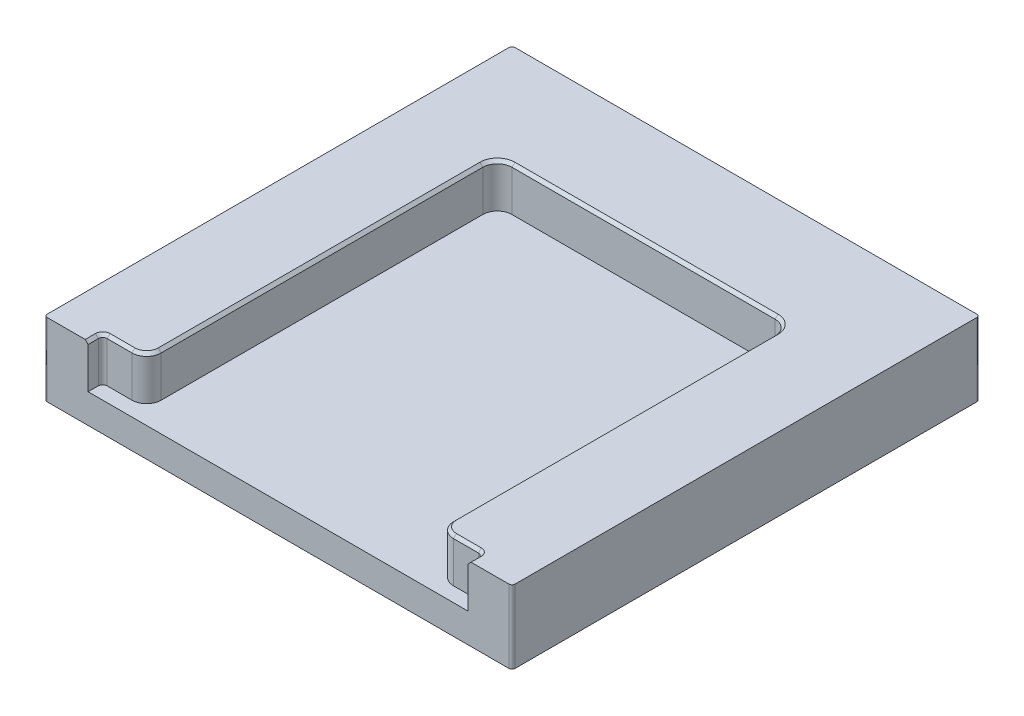
ISO-10303-21;
HEADER;
FILE_DESCRIPTION(('STEP AP214'),'2;1');
FILE_NAME('part.step','',(''),(''),'','','');
FILE_SCHEMA(('AUTOMOTIVE_DESIGN { 1 0 10303 214 1 1 1 1 }'));
ENDSEC;
DATA;
#1=APPLICATION_CONTEXT('core data for automotive mechanical design processes');
#2=APPLICATION_PROTOCOL_DEFINITION('international standard','automotive_design',2000,#1);
#3=PRODUCT_CONTEXT('',#1,'mechanical');
#4=PRODUCT('Part','Part','',(#3));
#5=PRODUCT_RELATED_PRODUCT_CATEGORY('part','',(#4));
#6=PRODUCT_DEFINITION_FORMATION('','',#4);
#7=PRODUCT_DEFINITION_CONTEXT('part definition',#1,'design');
#8=PRODUCT_DEFINITION('design','',#6,#7);
#9=PRODUCT_DEFINITION_SHAPE('','',#8);
#10=(LENGTH_UNIT() NAMED_UNIT(*) SI_UNIT(.MILLI.,.METRE.));
#11=(NAMED_UNIT(*) PLANE_ANGLE_UNIT() SI_UNIT($,.RADIAN.));
#12=(NAMED_UNIT(*) SI_UNIT($,.STERADIAN.) SOLID_ANGLE_UNIT());
#13=UNCERTAINTY_MEASURE_WITH_UNIT(LENGTH_MEASURE(1.E-05),#10,'distance_accuracy_value','');
#14=(GEOMETRIC_REPRESENTATION_CONTEXT(3) GLOBAL_UNCERTAINTY_ASSIGNED_CONTEXT((#13)) GLOBAL_UNIT_ASSIGNED_CONTEXT((#10,
#11,#12)) REPRESENTATION_CONTEXT('',''));
#15=CARTESIAN_POINT('',(0.,0.,0.));
#16=DIRECTION('',(0.,0.,1.));
#17=DIRECTION('',(1.,0.,0.));
#18=AXIS2_PLACEMENT_3D('',#15,#16,#17);
#19=CARTESIAN_POINT('',(158.,-50.,158.));
#20=DIRECTION('',(0.,1.,0.));
#21=DIRECTION('',(0.,0.,1.));
#22=AXIS2_PLACEMENT_3D('',#19,#20,#21);
#23=CYLINDRICAL_SURFACE('',#22,2.);
#24=CARTESIAN_POINT('',(158.,0.,158.));
#25=DIRECTION('',(0.,1.,0.));
#26=DIRECTION('',(0.,0.,-1.));
#27=AXIS2_PLACEMENT_3D('',#24,#25,#26);
#28=CIRCLE('',#27,2.);
#29=CARTESIAN_POINT('',(158.,0.,160.));
#30=VERTEX_POINT('',#29);
#31=CARTESIAN_POINT('',(160.,0.,158.));
#32=VERTEX_POINT('',#31);
#33=EDGE_CURVE('E293',#30,#32,#28,.T.);
#34=ORIENTED_EDGE('',*,*,#33,.F.);
#35=DIRECTION('',(0.,1.,0.));
#36=VECTOR('',#35,1.);
#37=CARTESIAN_POINT('',(158.,-50.,160.));
#38=LINE('',#37,#36);
#39=CARTESIAN_POINT('',(158.,-50.,160.));
#40=VERTEX_POINT('',#39);
#41=EDGE_CURVE('E318',#40,#30,#38,.T.);
#42=ORIENTED_EDGE('',*,*,#41,.F.);
#43=CARTESIAN_POINT('',(158.,-50.,158.));
#44=DIRECTION('',(0.,1.,0.));
#45=DIRECTION('',(0.,0.,-1.));
#46=AXIS2_PLACEMENT_3D('',#43,#44,#45);
#47=CIRCLE('',#46,2.);
#48=CARTESIAN_POINT('',(160.,-50.,158.));
#49=VERTEX_POINT('',#48);
#50=EDGE_CURVE('E267',#40,#49,#47,.T.);
#51=ORIENTED_EDGE('',*,*,#50,.T.);
#52=DIRECTION('',(0.,1.,0.));
#53=VECTOR('',#52,1.);
#54=CARTESIAN_POINT('',(160.,-50.,158.));
#55=LINE('',#54,#53);
#56=EDGE_CURVE('E292',#49,#32,#55,.T.);
#57=ORIENTED_EDGE('',*,*,#56,.T.);
#58=EDGE_LOOP('',(#34,#42,#51,#57));
#59=FACE_BOUND('',#58,.T.);
#60=ADVANCED_FACE('F39',(#59),#23,.T.);
#61=CARTESIAN_POINT('',(-158.,-50.,160.));
#62=DIRECTION('',(0.,0.,1.));
#63=DIRECTION('',(1.,0.,0.));
#64=AXIS2_PLACEMENT_3D('',#61,#62,#63);
#65=PLANE('',#64);
#66=DIRECTION('',(1.,0.,0.));
#67=VECTOR('',#66,1.);
#68=CARTESIAN_POINT('',(-158.,0.,160.));
#69=LINE('',#68,#67);
#70=CARTESIAN_POINT('',(132.,0.,160.));
#71=VERTEX_POINT('',#70);
#72=EDGE_CURVE('E315',#71,#30,#69,.T.);
#73=ORIENTED_EDGE('',*,*,#72,.F.);
#74=DIRECTION('',(0.707106781186548,0.707106781186548,0.));
#75=VECTOR('',#74,1.);
#76=CARTESIAN_POINT('',(-38.,-170.,160.));
#77=LINE('',#76,#75);
#78=CARTESIAN_POINT('',(130.,-1.99999999999995,160.));
#79=VERTEX_POINT('',#78);
#80=EDGE_CURVE('E259',#71,#79,#77,.F.);
#81=ORIENTED_EDGE('',*,*,#80,.T.);
#82=DIRECTION('',(0.,1.,0.));
#83=VECTOR('',#82,1.);
#84=CARTESIAN_POINT('',(130.,-30.,160.));
#85=LINE('',#84,#83);
#86=CARTESIAN_POINT('',(130.,-30.,160.));
#87=VERTEX_POINT('',#86);
#88=EDGE_CURVE('E237',#87,#79,#85,.T.);
#89=ORIENTED_EDGE('',*,*,#88,.F.);
#90=DIRECTION('',(1.,0.,0.));
#91=VECTOR('',#90,1.);
#92=CARTESIAN_POINT('',(-130.,-30.,160.));
#93=LINE('',#92,#91);
#94=CARTESIAN_POINT('',(-130.,-30.,160.));
#95=VERTEX_POINT('',#94);
#96=EDGE_CURVE('E245',#95,#87,#93,.T.);
#97=ORIENTED_EDGE('',*,*,#96,.F.);
#98=DIRECTION('',(0.,1.,0.));
#99=VECTOR('',#98,1.);
#100=CARTESIAN_POINT('',(-130.,-30.,160.));
#101=LINE('',#100,#99);
#102=CARTESIAN_POINT('',(-130.,-1.99999999999995,160.));
#103=VERTEX_POINT('',#102);
#104=EDGE_CURVE('E297',#95,#103,#101,.T.);
#105=ORIENTED_EDGE('',*,*,#104,.T.);
#106=DIRECTION('',(0.707106781186548,-0.707106781186548,0.));
#107=VECTOR('',#106,1.);
#108=CARTESIAN_POINT('',(-120.,-12.,160.));
#109=LINE('',#108,#107);
#110=CARTESIAN_POINT('',(-132.,0.,160.));
#111=VERTEX_POINT('',#110);
#112=EDGE_CURVE('E362',#103,#111,#109,.F.);
#113=ORIENTED_EDGE('',*,*,#112,.T.);
#114=CARTESIAN_POINT('',(-158.,0.,160.));
#115=VERTEX_POINT('',#114);
#116=EDGE_CURVE('E271',#115,#111,#69,.T.);
#117=ORIENTED_EDGE('',*,*,#116,.F.);
#118=DIRECTION('',(0.,1.,0.));
#119=VECTOR('',#118,1.);
#120=CARTESIAN_POINT('',(-158.,-50.,160.));
#121=LINE('',#120,#119);
#122=CARTESIAN_POINT('',(-158.,-50.,160.));
#123=VERTEX_POINT('',#122);
#124=EDGE_CURVE('E322',#123,#115,#121,.T.);
#125=ORIENTED_EDGE('',*,*,#124,.F.);
#126=DIRECTION('',(1.,0.,0.));
#127=VECTOR('',#126,1.);
#128=CARTESIAN_POINT('',(-158.,-50.,160.));
#129=LINE('',#128,#127);
#130=EDGE_CURVE('E289',#123,#40,#129,.T.);
#131=ORIENTED_EDGE('',*,*,#130,.T.);
#132=ORIENTED_EDGE('',*,*,#41,.T.);
#133=EDGE_LOOP('',(#73,#81,#89,#97,#105,#113,#117,#125,#131,#132));
#134=FACE_BOUND('',#133,.T.);
#135=ADVANCED_FACE('F257',(#134),#65,.T.);
#136=CARTESIAN_POINT('',(-158.,-50.,158.));
#137=DIRECTION('',(0.,1.,0.));
#138=DIRECTION('',(0.,0.,1.));
#139=AXIS2_PLACEMENT_3D('',#136,#137,#138);
#140=CYLINDRICAL_SURFACE('',#139,2.);
#141=CARTESIAN_POINT('',(-158.,0.,158.));
#142=DIRECTION('',(0.,1.,0.));
#143=DIRECTION('',(0.,0.,-1.));
#144=AXIS2_PLACEMENT_3D('',#141,#142,#143);
#145=CIRCLE('',#144,2.);
#146=CARTESIAN_POINT('',(-160.,0.,158.));
#147=VERTEX_POINT('',#146);
#148=EDGE_CURVE('E312',#147,#115,#145,.T.);
#149=ORIENTED_EDGE('',*,*,#148,.F.);
#150=DIRECTION('',(0.,1.,0.));
#151=VECTOR('',#150,1.);
#152=CARTESIAN_POINT('',(-160.,-50.,158.));
#153=LINE('',#152,#151);
#154=CARTESIAN_POINT('',(-160.,-50.,158.));
#155=VERTEX_POINT('',#154);
#156=EDGE_CURVE('E324',#155,#147,#153,.T.);
#157=ORIENTED_EDGE('',*,*,#156,.F.);
#158=CARTESIAN_POINT('',(-158.,-50.,158.));
#159=DIRECTION('',(0.,1.,0.));
#160=DIRECTION('',(0.,0.,-1.));
#161=AXIS2_PLACEMENT_3D('',#158,#159,#160);
#162=CIRCLE('',#161,2.);
#163=EDGE_CURVE('E286',#155,#123,#162,.T.);
#164=ORIENTED_EDGE('',*,*,#163,.T.);
#165=ORIENTED_EDGE('',*,*,#124,.T.);
#166=EDGE_LOOP('',(#149,#157,#164,#165));
#167=FACE_BOUND('',#166,.T.);
#168=ADVANCED_FACE('F545',(#167),#140,.T.);
#169=CARTESIAN_POINT('',(-160.,-50.,158.));
#170=DIRECTION('',(-1.,0.,0.));
#171=DIRECTION('',(0.,0.,1.));
#172=AXIS2_PLACEMENT_3D('',#169,#170,#171);
#173=PLANE('',#172);
#174=DIRECTION('',(0.,0.,1.));
#175=VECTOR('',#174,1.);
#176=CARTESIAN_POINT('',(-160.,0.,158.));
#177=LINE('',#176,#175);
#178=CARTESIAN_POINT('',(-160.,0.,-158.));
#179=VERTEX_POINT('',#178);
#180=EDGE_CURVE('E309',#179,#147,#177,.T.);
#181=ORIENTED_EDGE('',*,*,#180,.F.);
#182=DIRECTION('',(0.,1.,0.));
#183=VECTOR('',#182,1.);
#184=CARTESIAN_POINT('',(-160.,-50.,-158.));
#185=LINE('',#184,#183);
#186=CARTESIAN_POINT('',(-160.,-50.,-158.));
#187=VERTEX_POINT('',#186);
#188=EDGE_CURVE('E326',#187,#179,#185,.T.);
#189=ORIENTED_EDGE('',*,*,#188,.F.);
#190=DIRECTION('',(0.,0.,1.));
#191=VECTOR('',#190,1.);
#192=CARTESIAN_POINT('',(-160.,-50.,158.));
#193=LINE('',#192,#191);
#194=EDGE_CURVE('E283',#187,#155,#193,.T.);
#195=ORIENTED_EDGE('',*,*,#194,.T.);
#196=ORIENTED_EDGE('',*,*,#156,.T.);
#197=EDGE_LOOP('',(#181,#189,#195,#196));
#198=FACE_BOUND('',#197,.T.);
#199=ADVANCED_FACE('F849',(#198),#173,.T.);
#200=CARTESIAN_POINT('',(-158.,-50.,-158.));
#201=DIRECTION('',(0.,1.,0.));
#202=DIRECTION('',(0.,0.,1.));
#203=AXIS2_PLACEMENT_3D('',#200,#201,#202);
#204=CYLINDRICAL_SURFACE('',#203,2.);
#205=CARTESIAN_POINT('',(-158.,0.,-158.));
#206=DIRECTION('',(0.,1.,0.));
#207=DIRECTION('',(0.,0.,1.));
#208=AXIS2_PLACEMENT_3D('',#205,#206,#207);
#209=CIRCLE('',#208,2.);
#210=CARTESIAN_POINT('',(-158.,0.,-160.));
#211=VERTEX_POINT('',#210);
#212=EDGE_CURVE('E306',#211,#179,#209,.T.);
#213=ORIENTED_EDGE('',*,*,#212,.F.);
#214=DIRECTION('',(0.,1.,0.));
#215=VECTOR('',#214,1.);
#216=CARTESIAN_POINT('',(-158.,-50.,-160.));
#217=LINE('',#216,#215);
#218=CARTESIAN_POINT('',(-158.,-50.,-160.));
#219=VERTEX_POINT('',#218);
#220=EDGE_CURVE('E328',#219,#211,#217,.T.);
#221=ORIENTED_EDGE('',*,*,#220,.F.);
#222=CARTESIAN_POINT('',(-158.,-50.,-158.));
#223=DIRECTION('',(0.,1.,0.));
#224=DIRECTION('',(0.,0.,1.));
#225=AXIS2_PLACEMENT_3D('',#222,#223,#224);
#226=CIRCLE('',#225,2.);
#227=EDGE_CURVE('E280',#219,#187,#226,.T.);
#228=ORIENTED_EDGE('',*,*,#227,.T.);
#229=ORIENTED_EDGE('',*,*,#188,.T.);
#230=EDGE_LOOP('',(#213,#221,#228,#229));
#231=FACE_BOUND('',#230,.T.);
#232=ADVANCED_FACE('F840',(#231),#204,.T.);
#233=CARTESIAN_POINT('',(-158.,-50.,-160.));
#234=DIRECTION('',(0.,0.,-1.));
#235=DIRECTION('',(-1.,0.,0.));
#236=AXIS2_PLACEMENT_3D('',#233,#234,#235);
#237=PLANE('',#236);
#238=DIRECTION('',(-1.,0.,0.));
#239=VECTOR('',#238,1.);
#240=CARTESIAN_POINT('',(-158.,0.,-160.));
#241=LINE('',#240,#239);
#242=CARTESIAN_POINT('',(158.,0.,-160.));
#243=VERTEX_POINT('',#242);
#244=EDGE_CURVE('E303',#243,#211,#241,.T.);
#245=ORIENTED_EDGE('',*,*,#244,.F.);
#246=DIRECTION('',(0.,1.,0.));
#247=VECTOR('',#246,1.);
#248=CARTESIAN_POINT('',(158.,-50.,-160.));
#249=LINE('',#248,#247);
#250=CARTESIAN_POINT('',(158.,-50.,-160.));
#251=VERTEX_POINT('',#250);
#252=EDGE_CURVE('E330',#251,#243,#249,.T.);
#253=ORIENTED_EDGE('',*,*,#252,.F.);
#254=DIRECTION('',(-1.,0.,0.));
#255=VECTOR('',#254,1.);
#256=CARTESIAN_POINT('',(-158.,-50.,-160.));
#257=LINE('',#256,#255);
#258=EDGE_CURVE('E277',#251,#219,#257,.T.);
#259=ORIENTED_EDGE('',*,*,#258,.T.);
#260=ORIENTED_EDGE('',*,*,#220,.T.);
#261=EDGE_LOOP('',(#245,#253,#259,#260));
#262=FACE_BOUND('',#261,.T.);
#263=ADVANCED_FACE('F832',(#262),#237,.T.);
#264=CARTESIAN_POINT('',(158.,-50.,-158.));
#265=DIRECTION('',(0.,1.,0.));
#266=DIRECTION('',(0.,0.,1.));
#267=AXIS2_PLACEMENT_3D('',#264,#265,#266);
#268=CYLINDRICAL_SURFACE('',#267,2.);
#269=CARTESIAN_POINT('',(158.,0.,-158.));
#270=DIRECTION('',(0.,1.,0.));
#271=DIRECTION('',(0.,0.,1.));
#272=AXIS2_PLACEMENT_3D('',#269,#270,#271);
#273=CIRCLE('',#272,2.);
#274=CARTESIAN_POINT('',(160.,0.,-158.));
#275=VERTEX_POINT('',#274);
#276=EDGE_CURVE('E300',#275,#243,#273,.T.);
#277=ORIENTED_EDGE('',*,*,#276,.F.);
#278=DIRECTION('',(0.,1.,0.));
#279=VECTOR('',#278,1.);
#280=CARTESIAN_POINT('',(160.,-50.,-158.));
#281=LINE('',#280,#279);
#282=CARTESIAN_POINT('',(160.,-50.,-158.));
#283=VERTEX_POINT('',#282);
#284=EDGE_CURVE('E332',#283,#275,#281,.T.);
#285=ORIENTED_EDGE('',*,*,#284,.F.);
#286=CARTESIAN_POINT('',(158.,-50.,-158.));
#287=DIRECTION('',(0.,1.,0.));
#288=DIRECTION('',(0.,0.,1.));
#289=AXIS2_PLACEMENT_3D('',#286,#287,#288);
#290=CIRCLE('',#289,2.);
#291=EDGE_CURVE('E274',#283,#251,#290,.T.);
#292=ORIENTED_EDGE('',*,*,#291,.T.);
#293=ORIENTED_EDGE('',*,*,#252,.T.);
#294=EDGE_LOOP('',(#277,#285,#292,#293));
#295=FACE_BOUND('',#294,.T.);
#296=ADVANCED_FACE('F824',(#295),#268,.T.);
#297=CARTESIAN_POINT('',(160.,-50.,158.));
#298=DIRECTION('',(1.,0.,0.));
#299=DIRECTION('',(0.,0.,-1.));
#300=AXIS2_PLACEMENT_3D('',#297,#298,#299);
#301=PLANE('',#300);
#302=DIRECTION('',(0.,0.,-1.));
#303=VECTOR('',#302,1.);
#304=CARTESIAN_POINT('',(160.,0.,158.));
#305=LINE('',#304,#303);
#306=EDGE_CURVE('E296',#32,#275,#305,.T.);
#307=ORIENTED_EDGE('',*,*,#306,.F.);
#308=ORIENTED_EDGE('',*,*,#56,.F.);
#309=DIRECTION('',(0.,0.,-1.));
#310=VECTOR('',#309,1.);
#311=CARTESIAN_POINT('',(160.,-50.,158.));
#312=LINE('',#311,#310);
#313=EDGE_CURVE('E270',#49,#283,#312,.T.);
#314=ORIENTED_EDGE('',*,*,#313,.T.);
#315=ORIENTED_EDGE('',*,*,#284,.T.);
#316=EDGE_LOOP('',(#307,#308,#314,#315));
#317=FACE_BOUND('',#316,.T.);
#318=ADVANCED_FACE('F550',(#317),#301,.T.);
#319=CARTESIAN_POINT('',(158.,-50.,158.));
#320=DIRECTION('',(0.,-1.,0.));
#321=DIRECTION('',(0.,0.,-1.));
#322=AXIS2_PLACEMENT_3D('',#319,#320,#321);
#323=PLANE('',#322);
#324=ORIENTED_EDGE('',*,*,#50,.F.);
#325=ORIENTED_EDGE('',*,*,#130,.F.);
#326=ORIENTED_EDGE('',*,*,#163,.F.);
#327=ORIENTED_EDGE('',*,*,#194,.F.);
#328=ORIENTED_EDGE('',*,*,#227,.F.);
#329=ORIENTED_EDGE('',*,*,#258,.F.);
#330=ORIENTED_EDGE('',*,*,#291,.F.);
#331=ORIENTED_EDGE('',*,*,#313,.F.);
#332=EDGE_LOOP('',(#324,#325,#326,#327,#328,#329,#330,#331));
#333=FACE_BOUND('',#332,.T.);
#334=ADVANCED_FACE('F809',(#333),#323,.T.);
#335=CARTESIAN_POINT('',(158.,0.,158.));
#336=DIRECTION('',(0.,-1.,0.));
#337=DIRECTION('',(0.,0.,-1.));
#338=AXIS2_PLACEMENT_3D('',#335,#336,#337);
#339=PLANE('',#338);
#340=CARTESIAN_POINT('',(127.,0.,153.));
#341=DIRECTION('',(0.,-1.,0.));
#342=DIRECTION('',(0.,0.,-1.));
#343=AXIS2_PLACEMENT_3D('',#340,#341,#342);
#344=CIRCLE('',#343,4.99999999999995);
#345=CARTESIAN_POINT('',(127.,0.,148.));
#346=VERTEX_POINT('',#345);
#347=CARTESIAN_POINT('',(132.,0.,153.));
#348=VERTEX_POINT('',#347);
#349=EDGE_CURVE('E358',#346,#348,#344,.T.);
#350=ORIENTED_EDGE('',*,*,#349,.T.);
#351=DIRECTION('',(0.,0.,1.));
#352=VECTOR('',#351,1.);
#353=CARTESIAN_POINT('',(132.,0.,158.));
#354=LINE('',#353,#352);
#355=EDGE_CURVE('E360',#348,#71,#354,.T.);
#356=ORIENTED_EDGE('',*,*,#355,.T.);
#357=ORIENTED_EDGE('',*,*,#72,.T.);
#358=ORIENTED_EDGE('',*,*,#33,.T.);
#359=ORIENTED_EDGE('',*,*,#306,.T.);
#360=ORIENTED_EDGE('',*,*,#276,.T.);
#361=ORIENTED_EDGE('',*,*,#244,.T.);
#362=ORIENTED_EDGE('',*,*,#212,.T.);
#363=ORIENTED_EDGE('',*,*,#180,.T.);
#364=ORIENTED_EDGE('',*,*,#148,.T.);
#365=ORIENTED_EDGE('',*,*,#116,.T.);
#366=DIRECTION('',(0.,0.,-1.));
#367=VECTOR('',#366,1.);
#368=CARTESIAN_POINT('',(-132.,0.,158.));
#369=LINE('',#368,#367);
#370=CARTESIAN_POINT('',(-132.,0.,153.));
#371=VERTEX_POINT('',#370);
#372=EDGE_CURVE('E336',#111,#371,#369,.T.);
#373=ORIENTED_EDGE('',*,*,#372,.T.);
#374=CARTESIAN_POINT('',(-127.,0.,153.));
#375=DIRECTION('',(0.,-1.,0.));
#376=DIRECTION('',(0.,0.,-1.));
#377=AXIS2_PLACEMENT_3D('',#374,#375,#376);
#378=CIRCLE('',#377,4.99999999999992);
#379=CARTESIAN_POINT('',(-127.,0.,148.));
#380=VERTEX_POINT('',#379);
#381=EDGE_CURVE('E338',#371,#380,#378,.T.);
#382=ORIENTED_EDGE('',*,*,#381,.T.);
#383=DIRECTION('',(1.,0.,0.));
#384=VECTOR('',#383,1.);
#385=CARTESIAN_POINT('',(158.,0.,148.));
#386=LINE('',#385,#384);
#387=CARTESIAN_POINT('',(-110.,0.,148.));
#388=VERTEX_POINT('',#387);
#389=EDGE_CURVE('E340',#380,#388,#386,.T.);
#390=ORIENTED_EDGE('',*,*,#389,.T.);
#391=CARTESIAN_POINT('',(-110.,0.,140.));
#392=DIRECTION('',(0.,-1.,0.));
#393=DIRECTION('',(0.,0.,-1.));
#394=AXIS2_PLACEMENT_3D('',#391,#392,#393);
#395=CIRCLE('',#394,8.00000000000005);
#396=CARTESIAN_POINT('',(-102.,0.,140.));
#397=VERTEX_POINT('',#396);
#398=EDGE_CURVE('E342',#388,#397,#395,.F.);
#399=ORIENTED_EDGE('',*,*,#398,.T.);
#400=DIRECTION('',(0.,0.,-1.));
#401=VECTOR('',#400,1.);
#402=CARTESIAN_POINT('',(-102.,0.,158.));
#403=LINE('',#402,#401);
#404=CARTESIAN_POINT('',(-102.,0.,-80.));
#405=VERTEX_POINT('',#404);
#406=EDGE_CURVE('E344',#397,#405,#403,.T.);
#407=ORIENTED_EDGE('',*,*,#406,.T.);
#408=CARTESIAN_POINT('',(-90.,0.,-80.));
#409=DIRECTION('',(0.,-1.,0.));
#410=DIRECTION('',(0.,0.,-1.));
#411=AXIS2_PLACEMENT_3D('',#408,#409,#410);
#412=CIRCLE('',#411,11.9999999999999);
#413=CARTESIAN_POINT('',(-90.,0.,-91.9999999999999));
#414=VERTEX_POINT('',#413);
#415=EDGE_CURVE('E346',#405,#414,#412,.T.);
#416=ORIENTED_EDGE('',*,*,#415,.T.);
#417=DIRECTION('',(1.,0.,0.));
#418=VECTOR('',#417,1.);
#419=CARTESIAN_POINT('',(158.,0.,-91.9999999999999));
#420=LINE('',#419,#418);
#421=CARTESIAN_POINT('',(90.,0.,-91.9999999999999));
#422=VERTEX_POINT('',#421);
#423=EDGE_CURVE('E348',#414,#422,#420,.T.);
#424=ORIENTED_EDGE('',*,*,#423,.T.);
#425=CARTESIAN_POINT('',(90.,0.,-80.));
#426=DIRECTION('',(0.,-1.,0.));
#427=DIRECTION('',(0.,0.,-1.));
#428=AXIS2_PLACEMENT_3D('',#425,#426,#427);
#429=CIRCLE('',#428,11.9999999999999);
#430=CARTESIAN_POINT('',(102.,0.,-80.));
#431=VERTEX_POINT('',#430);
#432=EDGE_CURVE('E350',#422,#431,#429,.T.);
#433=ORIENTED_EDGE('',*,*,#432,.T.);
#434=DIRECTION('',(0.,0.,1.));
#435=VECTOR('',#434,1.);
#436=CARTESIAN_POINT('',(102.,0.,158.));
#437=LINE('',#436,#435);
#438=CARTESIAN_POINT('',(102.,0.,140.));
#439=VERTEX_POINT('',#438);
#440=EDGE_CURVE('E352',#431,#439,#437,.T.);
#441=ORIENTED_EDGE('',*,*,#440,.T.);
#442=CARTESIAN_POINT('',(110.,0.,140.));
#443=DIRECTION('',(0.,-1.,0.));
#444=DIRECTION('',(0.,0.,-1.));
#445=AXIS2_PLACEMENT_3D('',#442,#443,#444);
#446=CIRCLE('',#445,8.00000000000006);
#447=CARTESIAN_POINT('',(110.,0.,148.));
#448=VERTEX_POINT('',#447);
#449=EDGE_CURVE('E354',#439,#448,#446,.F.);
#450=ORIENTED_EDGE('',*,*,#449,.T.);
#451=DIRECTION('',(1.,0.,0.));
#452=VECTOR('',#451,1.);
#453=CARTESIAN_POINT('',(158.,0.,148.));
#454=LINE('',#453,#452);
#455=EDGE_CURVE('E356',#448,#346,#454,.T.);
#456=ORIENTED_EDGE('',*,*,#455,.T.);
#457=EDGE_LOOP('',(#350,#356,#357,#358,#359,#360,#361,#362,#363,#364,#365,#373,#382,#390,#399,
#407,#416,#424,#433,#441,#450,#456));
#458=FACE_BOUND('',#457,.T.);
#459=ADVANCED_FACE('F479',(#458),#339,.F.);
#460=CARTESIAN_POINT('',(-130.,-30.,153.));
#461=DIRECTION('',(-1.,0.,0.));
#462=DIRECTION('',(0.,0.,1.));
#463=AXIS2_PLACEMENT_3D('',#460,#461,#462);
#464=PLANE('',#463);
#465=DIRECTION('',(0.,1.,0.));
#466=VECTOR('',#465,1.);
#467=CARTESIAN_POINT('',(-130.,-30.,153.));
#468=LINE('',#467,#466);
#469=CARTESIAN_POINT('',(-130.,-30.,153.));
#470=VERTEX_POINT('',#469);
#471=CARTESIAN_POINT('',(-130.,-1.99999999999995,153.));
#472=VERTEX_POINT('',#471);
#473=EDGE_CURVE('E429',#470,#472,#468,.T.);
#474=ORIENTED_EDGE('',*,*,#473,.T.);
#475=DIRECTION('',(0.,0.,1.));
#476=VECTOR('',#475,1.);
#477=CARTESIAN_POINT('',(-130.,-1.99999999999995,153.));
#478=LINE('',#477,#476);
#479=EDGE_CURVE('E11',#472,#103,#478,.T.);
#480=ORIENTED_EDGE('',*,*,#479,.T.);
#481=ORIENTED_EDGE('',*,*,#104,.F.);
#482=DIRECTION('',(0.,0.,1.));
#483=VECTOR('',#482,1.);
#484=CARTESIAN_POINT('',(-130.,-30.,153.));
#485=LINE('',#484,#483);
#486=EDGE_CURVE('E252',#470,#95,#485,.T.);
#487=ORIENTED_EDGE('',*,*,#486,.F.);
#488=EDGE_LOOP('',(#474,#480,#481,#487));
#489=FACE_BOUND('',#488,.T.);
#490=ADVANCED_FACE('F428',(#489),#464,.F.);
#491=CARTESIAN_POINT('',(-127.,-30.,153.));
#492=DIRECTION('',(0.,1.,0.));
#493=DIRECTION('',(0.,0.,1.));
#494=AXIS2_PLACEMENT_3D('',#491,#492,#493);
#495=CYLINDRICAL_SURFACE('',#494,2.99999999999999);
#496=DIRECTION('',(0.,1.,0.));
#497=VECTOR('',#496,1.);
#498=CARTESIAN_POINT('',(-127.,-30.,150.));
#499=LINE('',#498,#497);
#500=CARTESIAN_POINT('',(-127.,-30.,150.));
#501=VERTEX_POINT('',#500);
#502=CARTESIAN_POINT('',(-127.,-1.99999999999995,150.));
#503=VERTEX_POINT('',#502);
#504=EDGE_CURVE('E432',#501,#503,#499,.T.);
#505=ORIENTED_EDGE('',*,*,#504,.T.);
#506=CARTESIAN_POINT('',(-127.,-1.99999999999995,153.));
#507=DIRECTION('',(0.,-1.,0.));
#508=DIRECTION('',(0.,0.,-1.));
#509=AXIS2_PLACEMENT_3D('',#506,#507,#508);
#510=CIRCLE('',#509,2.99999999999999);
#511=EDGE_CURVE('E49',#503,#472,#510,.F.);
#512=ORIENTED_EDGE('',*,*,#511,.T.);
#513=ORIENTED_EDGE('',*,*,#473,.F.);
#514=CARTESIAN_POINT('',(-127.,-30.,153.));
#515=DIRECTION('',(0.,1.,0.));
#516=DIRECTION('',(0.,0.,1.));
#517=AXIS2_PLACEMENT_3D('',#514,#515,#516);
#518=CIRCLE('',#517,2.99999999999999);
#519=EDGE_CURVE('E263',#501,#470,#518,.T.);
#520=ORIENTED_EDGE('',*,*,#519,.F.);
#521=EDGE_LOOP('',(#505,#512,#513,#520));
#522=FACE_BOUND('',#521,.T.);
#523=ADVANCED_FACE('F511',(#522),#495,.F.);
#524=CARTESIAN_POINT('',(-110.,-30.,150.));
#525=DIRECTION('',(0.,0.,-1.));
#526=DIRECTION('',(-1.,0.,0.));
#527=AXIS2_PLACEMENT_3D('',#524,#525,#526);
#528=PLANE('',#527);
#529=DIRECTION('',(0.,1.,0.));
#530=VECTOR('',#529,1.);
#531=CARTESIAN_POINT('',(-110.,-30.,150.));
#532=LINE('',#531,#530);
#533=CARTESIAN_POINT('',(-110.,-30.,150.));
#534=VERTEX_POINT('',#533);
#535=CARTESIAN_POINT('',(-110.,-1.99999999999995,150.));
#536=VERTEX_POINT('',#535);
#537=EDGE_CURVE('E437',#534,#536,#532,.T.);
#538=ORIENTED_EDGE('',*,*,#537,.T.);
#539=DIRECTION('',(-1.,0.,0.));
#540=VECTOR('',#539,1.);
#541=CARTESIAN_POINT('',(-110.,-1.99999999999995,150.));
#542=LINE('',#541,#540);
#543=EDGE_CURVE('E64',#536,#503,#542,.T.);
#544=ORIENTED_EDGE('',*,*,#543,.T.);
#545=ORIENTED_EDGE('',*,*,#504,.F.);
#546=DIRECTION('',(-1.,0.,0.));
#547=VECTOR('',#546,1.);
#548=CARTESIAN_POINT('',(-110.,-30.,150.));
#549=LINE('',#548,#547);
#550=EDGE_CURVE('E507',#534,#501,#549,.T.);
#551=ORIENTED_EDGE('',*,*,#550,.F.);
#552=EDGE_LOOP('',(#538,#544,#545,#551));
#553=FACE_BOUND('',#552,.T.);
#554=ADVANCED_FACE('F512',(#553),#528,.F.);
#555=CARTESIAN_POINT('',(-110.,-30.,140.));
#556=DIRECTION('',(0.,1.,0.));
#557=DIRECTION('',(0.,0.,1.));
#558=AXIS2_PLACEMENT_3D('',#555,#556,#557);
#559=CYLINDRICAL_SURFACE('',#558,10.);
#560=DIRECTION('',(0.,1.,0.));
#561=VECTOR('',#560,1.);
#562=CARTESIAN_POINT('',(-100.,-30.,140.));
#563=LINE('',#562,#561);
#564=CARTESIAN_POINT('',(-100.,-30.,140.));
#565=VERTEX_POINT('',#564);
#566=CARTESIAN_POINT('',(-100.,-1.99999999999995,140.));
#567=VERTEX_POINT('',#566);
#568=EDGE_CURVE('E439',#565,#567,#563,.T.);
#569=ORIENTED_EDGE('',*,*,#568,.T.);
#570=CARTESIAN_POINT('',(-110.,-1.99999999999995,140.));
#571=DIRECTION('',(0.,-1.,0.));
#572=DIRECTION('',(0.,0.,-1.));
#573=AXIS2_PLACEMENT_3D('',#570,#571,#572);
#574=CIRCLE('',#573,10.);
#575=EDGE_CURVE('E381',#567,#536,#574,.T.);
#576=ORIENTED_EDGE('',*,*,#575,.T.);
#577=ORIENTED_EDGE('',*,*,#537,.F.);
#578=CARTESIAN_POINT('',(-110.,-30.,140.));
#579=DIRECTION('',(0.,-1.,0.));
#580=DIRECTION('',(0.,0.,-1.));
#581=AXIS2_PLACEMENT_3D('',#578,#579,#580);
#582=CIRCLE('',#581,10.);
#583=EDGE_CURVE('E504',#565,#534,#582,.T.);
#584=ORIENTED_EDGE('',*,*,#583,.F.);
#585=EDGE_LOOP('',(#569,#576,#577,#584));
#586=FACE_BOUND('',#585,.T.);
#587=ADVANCED_FACE('F516',(#586),#559,.T.);
#588=CARTESIAN_POINT('',(-100.,-30.,-80.));
#589=DIRECTION('',(-1.,0.,0.));
#590=DIRECTION('',(0.,0.,1.));
#591=AXIS2_PLACEMENT_3D('',#588,#589,#590);
#592=PLANE('',#591);
#593=DIRECTION('',(0.,1.,0.));
#594=VECTOR('',#593,1.);
#595=CARTESIAN_POINT('',(-100.,-30.,-80.));
#596=LINE('',#595,#594);
#597=CARTESIAN_POINT('',(-100.,-30.,-80.));
#598=VERTEX_POINT('',#597);
#599=CARTESIAN_POINT('',(-100.,-1.99999999999995,-80.));
#600=VERTEX_POINT('',#599);
#601=EDGE_CURVE('E442',#598,#600,#596,.T.);
#602=ORIENTED_EDGE('',*,*,#601,.T.);
#603=DIRECTION('',(0.,0.,1.));
#604=VECTOR('',#603,1.);
#605=CARTESIAN_POINT('',(-100.,-1.99999999999995,-80.));
#606=LINE('',#605,#604);
#607=EDGE_CURVE('E379',#600,#567,#606,.T.);
#608=ORIENTED_EDGE('',*,*,#607,.T.);
#609=ORIENTED_EDGE('',*,*,#568,.F.);
#610=DIRECTION('',(0.,0.,1.));
#611=VECTOR('',#610,1.);
#612=CARTESIAN_POINT('',(-100.,-30.,-80.));
#613=LINE('',#612,#611);
#614=EDGE_CURVE('E501',#598,#565,#613,.T.);
#615=ORIENTED_EDGE('',*,*,#614,.F.);
#616=EDGE_LOOP('',(#602,#608,#609,#615));
#617=FACE_BOUND('',#616,.T.);
#618=ADVANCED_FACE('F764',(#617),#592,.F.);
#619=CARTESIAN_POINT('',(-90.,-30.,-80.));
#620=DIRECTION('',(0.,1.,0.));
#621=DIRECTION('',(0.,0.,1.));
#622=AXIS2_PLACEMENT_3D('',#619,#620,#621);
#623=CYLINDRICAL_SURFACE('',#622,9.99999999999999);
#624=DIRECTION('',(0.,1.,0.));
#625=VECTOR('',#624,1.);
#626=CARTESIAN_POINT('',(-90.,-30.,-90.));
#627=LINE('',#626,#625);
#628=CARTESIAN_POINT('',(-90.,-30.,-90.));
#629=VERTEX_POINT('',#628);
#630=CARTESIAN_POINT('',(-90.,-1.99999999999995,-90.));
#631=VERTEX_POINT('',#630);
#632=EDGE_CURVE('E445',#629,#631,#627,.T.);
#633=ORIENTED_EDGE('',*,*,#632,.T.);
#634=CARTESIAN_POINT('',(-90.,-1.99999999999995,-80.));
#635=DIRECTION('',(0.,-1.,0.));
#636=DIRECTION('',(0.,0.,-1.));
#637=AXIS2_PLACEMENT_3D('',#634,#635,#636);
#638=CIRCLE('',#637,9.99999999999999);
#639=EDGE_CURVE('E377',#631,#600,#638,.F.);
#640=ORIENTED_EDGE('',*,*,#639,.T.);
#641=ORIENTED_EDGE('',*,*,#601,.F.);
#642=CARTESIAN_POINT('',(-90.,-30.,-80.));
#643=DIRECTION('',(0.,1.,0.));
#644=DIRECTION('',(0.,0.,1.));
#645=AXIS2_PLACEMENT_3D('',#642,#643,#644);
#646=CIRCLE('',#645,9.99999999999999);
#647=EDGE_CURVE('E498',#629,#598,#646,.T.);
#648=ORIENTED_EDGE('',*,*,#647,.F.);
#649=EDGE_LOOP('',(#633,#640,#641,#648));
#650=FACE_BOUND('',#649,.T.);
#651=ADVANCED_FACE('F755',(#650),#623,.F.);
#652=CARTESIAN_POINT('',(90.,-30.,-90.));
#653=DIRECTION('',(0.,0.,-1.));
#654=DIRECTION('',(-1.,0.,0.));
#655=AXIS2_PLACEMENT_3D('',#652,#653,#654);
#656=PLANE('',#655);
#657=DIRECTION('',(0.,1.,0.));
#658=VECTOR('',#657,1.);
#659=CARTESIAN_POINT('',(90.,-30.,-90.));
#660=LINE('',#659,#658);
#661=CARTESIAN_POINT('',(90.,-30.,-90.));
#662=VERTEX_POINT('',#661);
#663=CARTESIAN_POINT('',(90.,-1.99999999999995,-90.));
#664=VERTEX_POINT('',#663);
#665=EDGE_CURVE('E448',#662,#664,#660,.T.);
#666=ORIENTED_EDGE('',*,*,#665,.T.);
#667=DIRECTION('',(-1.,0.,0.));
#668=VECTOR('',#667,1.);
#669=CARTESIAN_POINT('',(90.,-1.99999999999995,-90.));
#670=LINE('',#669,#668);
#671=EDGE_CURVE('E375',#664,#631,#670,.T.);
#672=ORIENTED_EDGE('',*,*,#671,.T.);
#673=ORIENTED_EDGE('',*,*,#632,.F.);
#674=DIRECTION('',(-1.,0.,0.));
#675=VECTOR('',#674,1.);
#676=CARTESIAN_POINT('',(90.,-30.,-90.));
#677=LINE('',#676,#675);
#678=EDGE_CURVE('E495',#662,#629,#677,.T.);
#679=ORIENTED_EDGE('',*,*,#678,.F.);
#680=EDGE_LOOP('',(#666,#672,#673,#679));
#681=FACE_BOUND('',#680,.T.);
#682=ADVANCED_FACE('F746',(#681),#656,.F.);
#683=CARTESIAN_POINT('',(90.,-30.,-80.));
#684=DIRECTION('',(0.,1.,0.));
#685=DIRECTION('',(0.,0.,1.));
#686=AXIS2_PLACEMENT_3D('',#683,#684,#685);
#687=CYLINDRICAL_SURFACE('',#686,9.99999999999999);
#688=DIRECTION('',(0.,1.,0.));
#689=VECTOR('',#688,1.);
#690=CARTESIAN_POINT('',(100.,-30.,-80.));
#691=LINE('',#690,#689);
#692=CARTESIAN_POINT('',(100.,-30.,-80.));
#693=VERTEX_POINT('',#692);
#694=CARTESIAN_POINT('',(100.,-1.99999999999995,-80.));
#695=VERTEX_POINT('',#694);
#696=EDGE_CURVE('E451',#693,#695,#691,.T.);
#697=ORIENTED_EDGE('',*,*,#696,.T.);
#698=CARTESIAN_POINT('',(90.,-1.99999999999995,-80.));
#699=DIRECTION('',(0.,-1.,0.));
#700=DIRECTION('',(0.,0.,-1.));
#701=AXIS2_PLACEMENT_3D('',#698,#699,#700);
#702=CIRCLE('',#701,9.99999999999999);
#703=EDGE_CURVE('E373',#695,#664,#702,.F.);
#704=ORIENTED_EDGE('',*,*,#703,.T.);
#705=ORIENTED_EDGE('',*,*,#665,.F.);
#706=CARTESIAN_POINT('',(90.,-30.,-80.));
#707=DIRECTION('',(0.,1.,0.));
#708=DIRECTION('',(0.,0.,1.));
#709=AXIS2_PLACEMENT_3D('',#706,#707,#708);
#710=CIRCLE('',#709,9.99999999999999);
#711=EDGE_CURVE('E492',#693,#662,#710,.T.);
#712=ORIENTED_EDGE('',*,*,#711,.F.);
#713=EDGE_LOOP('',(#697,#704,#705,#712));
#714=FACE_BOUND('',#713,.T.);
#715=ADVANCED_FACE('F737',(#714),#687,.F.);
#716=CARTESIAN_POINT('',(100.,-30.,-80.));
#717=DIRECTION('',(1.,0.,0.));
#718=DIRECTION('',(0.,0.,-1.));
#719=AXIS2_PLACEMENT_3D('',#716,#717,#718);
#720=PLANE('',#719);
#721=DIRECTION('',(0.,1.,0.));
#722=VECTOR('',#721,1.);
#723=CARTESIAN_POINT('',(100.,-30.,140.));
#724=LINE('',#723,#722);
#725=CARTESIAN_POINT('',(100.,-30.,140.));
#726=VERTEX_POINT('',#725);
#727=CARTESIAN_POINT('',(100.,-1.99999999999995,140.));
#728=VERTEX_POINT('',#727);
#729=EDGE_CURVE('E454',#726,#728,#724,.T.);
#730=ORIENTED_EDGE('',*,*,#729,.T.);
#731=DIRECTION('',(0.,0.,-1.));
#732=VECTOR('',#731,1.);
#733=CARTESIAN_POINT('',(100.,-1.99999999999995,-80.));
#734=LINE('',#733,#732);
#735=EDGE_CURVE('E371',#728,#695,#734,.T.);
#736=ORIENTED_EDGE('',*,*,#735,.T.);
#737=ORIENTED_EDGE('',*,*,#696,.F.);
#738=DIRECTION('',(0.,0.,-1.));
#739=VECTOR('',#738,1.);
#740=CARTESIAN_POINT('',(100.,-30.,-80.));
#741=LINE('',#740,#739);
#742=EDGE_CURVE('E489',#726,#693,#741,.T.);
#743=ORIENTED_EDGE('',*,*,#742,.F.);
#744=EDGE_LOOP('',(#730,#736,#737,#743));
#745=FACE_BOUND('',#744,.T.);
#746=ADVANCED_FACE('F728',(#745),#720,.F.);
#747=CARTESIAN_POINT('',(110.,-30.,140.));
#748=DIRECTION('',(0.,1.,0.));
#749=DIRECTION('',(0.,0.,1.));
#750=AXIS2_PLACEMENT_3D('',#747,#748,#749);
#751=CYLINDRICAL_SURFACE('',#750,10.);
#752=DIRECTION('',(0.,1.,0.));
#753=VECTOR('',#752,1.);
#754=CARTESIAN_POINT('',(110.,-30.,150.));
#755=LINE('',#754,#753);
#756=CARTESIAN_POINT('',(110.,-30.,150.));
#757=VERTEX_POINT('',#756);
#758=CARTESIAN_POINT('',(110.,-1.99999999999995,150.));
#759=VERTEX_POINT('',#758);
#760=EDGE_CURVE('E457',#757,#759,#755,.T.);
#761=ORIENTED_EDGE('',*,*,#760,.T.);
#762=CARTESIAN_POINT('',(110.,-1.99999999999995,140.));
#763=DIRECTION('',(0.,-1.,0.));
#764=DIRECTION('',(0.,0.,-1.));
#765=AXIS2_PLACEMENT_3D('',#762,#763,#764);
#766=CIRCLE('',#765,10.);
#767=EDGE_CURVE('E369',#759,#728,#766,.T.);
#768=ORIENTED_EDGE('',*,*,#767,.T.);
#769=ORIENTED_EDGE('',*,*,#729,.F.);
#770=CARTESIAN_POINT('',(110.,-30.,140.));
#771=DIRECTION('',(0.,-1.,0.));
#772=DIRECTION('',(0.,0.,-1.));
#773=AXIS2_PLACEMENT_3D('',#770,#771,#772);
#774=CIRCLE('',#773,10.);
#775=EDGE_CURVE('E484',#757,#726,#774,.T.);
#776=ORIENTED_EDGE('',*,*,#775,.F.);
#777=EDGE_LOOP('',(#761,#768,#769,#776));
#778=FACE_BOUND('',#777,.T.);
#779=ADVANCED_FACE('F720',(#778),#751,.T.);
#780=CARTESIAN_POINT('',(110.,-30.,150.));
#781=DIRECTION('',(0.,0.,-1.));
#782=DIRECTION('',(-1.,0.,0.));
#783=AXIS2_PLACEMENT_3D('',#780,#781,#782);
#784=PLANE('',#783);
#785=DIRECTION('',(0.,1.,0.));
#786=VECTOR('',#785,1.);
#787=CARTESIAN_POINT('',(127.,-30.,150.));
#788=LINE('',#787,#786);
#789=CARTESIAN_POINT('',(127.,-30.,150.));
#790=VERTEX_POINT('',#789);
#791=CARTESIAN_POINT('',(127.,-1.99999999999995,150.));
#792=VERTEX_POINT('',#791);
#793=EDGE_CURVE('E261',#790,#792,#788,.T.);
#794=ORIENTED_EDGE('',*,*,#793,.T.);
#795=DIRECTION('',(-1.,0.,0.));
#796=VECTOR('',#795,1.);
#797=CARTESIAN_POINT('',(110.,-1.99999999999995,150.));
#798=LINE('',#797,#796);
#799=EDGE_CURVE('E367',#792,#759,#798,.T.);
#800=ORIENTED_EDGE('',*,*,#799,.T.);
#801=ORIENTED_EDGE('',*,*,#760,.F.);
#802=DIRECTION('',(-1.,0.,0.));
#803=VECTOR('',#802,1.);
#804=CARTESIAN_POINT('',(110.,-30.,150.));
#805=LINE('',#804,#803);
#806=EDGE_CURVE('E465',#790,#757,#805,.T.);
#807=ORIENTED_EDGE('',*,*,#806,.F.);
#808=EDGE_LOOP('',(#794,#800,#801,#807));
#809=FACE_BOUND('',#808,.T.);
#810=ADVANCED_FACE('F463',(#809),#784,.F.);
#811=CARTESIAN_POINT('',(127.,-30.,153.));
#812=DIRECTION('',(0.,1.,0.));
#813=DIRECTION('',(0.,0.,1.));
#814=AXIS2_PLACEMENT_3D('',#811,#812,#813);
#815=CYLINDRICAL_SURFACE('',#814,2.99999999999999);
#816=DIRECTION('',(0.,1.,0.));
#817=VECTOR('',#816,1.);
#818=CARTESIAN_POINT('',(130.,-30.,153.));
#819=LINE('',#818,#817);
#820=CARTESIAN_POINT('',(130.,-30.,153.));
#821=VERTEX_POINT('',#820);
#822=CARTESIAN_POINT('',(130.,-1.99999999999995,153.));
#823=VERTEX_POINT('',#822);
#824=EDGE_CURVE('E240',#821,#823,#819,.T.);
#825=ORIENTED_EDGE('',*,*,#824,.T.);
#826=CARTESIAN_POINT('',(127.,-1.99999999999995,153.));
#827=DIRECTION('',(0.,-1.,0.));
#828=DIRECTION('',(0.,0.,-1.));
#829=AXIS2_PLACEMENT_3D('',#826,#827,#828);
#830=CIRCLE('',#829,2.99999999999999);
#831=EDGE_CURVE('E365',#823,#792,#830,.F.);
#832=ORIENTED_EDGE('',*,*,#831,.T.);
#833=ORIENTED_EDGE('',*,*,#793,.F.);
#834=CARTESIAN_POINT('',(127.,-30.,153.));
#835=DIRECTION('',(0.,1.,0.));
#836=DIRECTION('',(0.,0.,1.));
#837=AXIS2_PLACEMENT_3D('',#834,#835,#836);
#838=CIRCLE('',#837,2.99999999999999);
#839=EDGE_CURVE('E244',#821,#790,#838,.T.);
#840=ORIENTED_EDGE('',*,*,#839,.F.);
#841=EDGE_LOOP('',(#825,#832,#833,#840));
#842=FACE_BOUND('',#841,.T.);
#843=ADVANCED_FACE('F482',(#842),#815,.F.);
#844=CARTESIAN_POINT('',(130.,-30.,153.));
#845=DIRECTION('',(1.,0.,0.));
#846=DIRECTION('',(0.,0.,-1.));
#847=AXIS2_PLACEMENT_3D('',#844,#845,#846);
#848=PLANE('',#847);
#849=ORIENTED_EDGE('',*,*,#88,.T.);
#850=DIRECTION('',(0.,0.,-1.));
#851=VECTOR('',#850,1.);
#852=CARTESIAN_POINT('',(130.,-1.99999999999995,153.));
#853=LINE('',#852,#851);
#854=EDGE_CURVE('E321',#79,#823,#853,.T.);
#855=ORIENTED_EDGE('',*,*,#854,.T.);
#856=ORIENTED_EDGE('',*,*,#824,.F.);
#857=DIRECTION('',(0.,0.,-1.));
#858=VECTOR('',#857,1.);
#859=CARTESIAN_POINT('',(130.,-30.,153.));
#860=LINE('',#859,#858);
#861=EDGE_CURVE('E232',#87,#821,#860,.T.);
#862=ORIENTED_EDGE('',*,*,#861,.F.);
#863=EDGE_LOOP('',(#849,#855,#856,#862));
#864=FACE_BOUND('',#863,.T.);
#865=ADVANCED_FACE('F234',(#864),#848,.F.);
#866=CARTESIAN_POINT('',(127.,-30.,153.));
#867=DIRECTION('',(0.,1.,0.));
#868=DIRECTION('',(0.,0.,1.));
#869=AXIS2_PLACEMENT_3D('',#866,#867,#868);
#870=PLANE('',#869);
#871=ORIENTED_EDGE('',*,*,#96,.T.);
#872=ORIENTED_EDGE('',*,*,#861,.T.);
#873=ORIENTED_EDGE('',*,*,#839,.T.);
#874=ORIENTED_EDGE('',*,*,#806,.T.);
#875=ORIENTED_EDGE('',*,*,#775,.T.);
#876=ORIENTED_EDGE('',*,*,#742,.T.);
#877=ORIENTED_EDGE('',*,*,#711,.T.);
#878=ORIENTED_EDGE('',*,*,#678,.T.);
#879=ORIENTED_EDGE('',*,*,#647,.T.);
#880=ORIENTED_EDGE('',*,*,#614,.T.);
#881=ORIENTED_EDGE('',*,*,#583,.T.);
#882=ORIENTED_EDGE('',*,*,#550,.T.);
#883=ORIENTED_EDGE('',*,*,#519,.T.);
#884=ORIENTED_EDGE('',*,*,#486,.T.);
#885=EDGE_LOOP('',(#871,#872,#873,#874,#875,#876,#877,#878,#879,#880,#881,#882,#883,#884));
#886=FACE_BOUND('',#885,.T.);
#887=ADVANCED_FACE('F249',(#886),#870,.T.);
#888=CARTESIAN_POINT('',(-130.,-1.99999999999995,153.));
#889=DIRECTION('',(-0.707106781186548,-0.707106781186548,0.));
#890=DIRECTION('',(0.,0.,1.));
#891=AXIS2_PLACEMENT_3D('',#888,#889,#890);
#892=PLANE('',#891);
#893=ORIENTED_EDGE('',*,*,#112,.F.);
#894=ORIENTED_EDGE('',*,*,#479,.F.);
#895=DIRECTION('',(0.707106781186548,-0.707106781186548,0.));
#896=VECTOR('',#895,1.);
#897=CARTESIAN_POINT('',(-132.,0.,153.));
#898=LINE('',#897,#896);
#899=EDGE_CURVE('E44',#371,#472,#898,.T.);
#900=ORIENTED_EDGE('',*,*,#899,.F.);
#901=ORIENTED_EDGE('',*,*,#372,.F.);
#902=EDGE_LOOP('',(#893,#894,#900,#901));
#903=FACE_BOUND('',#902,.T.);
#904=ADVANCED_FACE('F42',(#903),#892,.F.);
#905=CARTESIAN_POINT('',(-127.,-1.99999999999995,153.));
#906=DIRECTION('',(0.,1.,0.));
#907=DIRECTION('',(0.,0.,1.));
#908=AXIS2_PLACEMENT_3D('',#905,#906,#907);
#909=CONICAL_SURFACE('',#908,2.99999999999999,0.785398163397445);
#910=ORIENTED_EDGE('',*,*,#899,.T.);
#911=ORIENTED_EDGE('',*,*,#511,.F.);
#912=DIRECTION('',(0.,-0.707106781186548,0.707106781186548));
#913=VECTOR('',#912,1.);
#914=CARTESIAN_POINT('',(-127.,0.,148.));
#915=LINE('',#914,#913);
#916=EDGE_CURVE('E413',#380,#503,#915,.T.);
#917=ORIENTED_EDGE('',*,*,#916,.F.);
#918=ORIENTED_EDGE('',*,*,#381,.F.);
#919=EDGE_LOOP('',(#910,#911,#917,#918));
#920=FACE_BOUND('',#919,.T.);
#921=ADVANCED_FACE('F422',(#920),#909,.F.);
#922=CARTESIAN_POINT('',(-110.,-1.99999999999995,150.));
#923=DIRECTION('',(0.,-0.707106781186548,-0.707106781186548));
#924=DIRECTION('',(-1.,0.,0.));
#925=AXIS2_PLACEMENT_3D('',#922,#923,#924);
#926=PLANE('',#925);
#927=ORIENTED_EDGE('',*,*,#916,.T.);
#928=ORIENTED_EDGE('',*,*,#543,.F.);
#929=DIRECTION('',(0.,-0.707106781186548,0.707106781186548));
#930=VECTOR('',#929,1.);
#931=CARTESIAN_POINT('',(-110.,0.,148.));
#932=LINE('',#931,#930);
#933=EDGE_CURVE('E411',#388,#536,#932,.T.);
#934=ORIENTED_EDGE('',*,*,#933,.F.);
#935=ORIENTED_EDGE('',*,*,#389,.F.);
#936=EDGE_LOOP('',(#927,#928,#934,#935));
#937=FACE_BOUND('',#936,.T.);
#938=ADVANCED_FACE('F530',(#937),#926,.F.);
#939=CARTESIAN_POINT('',(-110.,-1.99999999999995,140.));
#940=DIRECTION('',(0.,-1.,0.));
#941=DIRECTION('',(0.,0.,-1.));
#942=AXIS2_PLACEMENT_3D('',#939,#940,#941);
#943=CONICAL_SURFACE('',#942,10.,0.78539816339745);
#944=ORIENTED_EDGE('',*,*,#933,.T.);
#945=ORIENTED_EDGE('',*,*,#575,.F.);
#946=DIRECTION('',(0.70710678118655,-0.707106781186545,0.));
#947=VECTOR('',#946,1.);
#948=CARTESIAN_POINT('',(-102.,0.,140.));
#949=LINE('',#948,#947);
#950=EDGE_CURVE('E408',#397,#567,#949,.T.);
#951=ORIENTED_EDGE('',*,*,#950,.F.);
#952=ORIENTED_EDGE('',*,*,#398,.F.);
#953=EDGE_LOOP('',(#944,#945,#951,#952));
#954=FACE_BOUND('',#953,.T.);
#955=ADVANCED_FACE('F520',(#954),#943,.T.);
#956=CARTESIAN_POINT('',(-100.,-1.99999999999995,-80.));
#957=DIRECTION('',(-0.707106781186545,-0.70710678118655,0.));
#958=DIRECTION('',(0.,0.,1.));
#959=AXIS2_PLACEMENT_3D('',#956,#957,#958);
#960=PLANE('',#959);
#961=ORIENTED_EDGE('',*,*,#950,.T.);
#962=ORIENTED_EDGE('',*,*,#607,.F.);
#963=DIRECTION('',(0.70710678118655,-0.707106781186545,0.));
#964=VECTOR('',#963,1.);
#965=CARTESIAN_POINT('',(-102.,0.,-80.));
#966=LINE('',#965,#964);
#967=EDGE_CURVE('E405',#405,#600,#966,.T.);
#968=ORIENTED_EDGE('',*,*,#967,.F.);
#969=ORIENTED_EDGE('',*,*,#406,.F.);
#970=EDGE_LOOP('',(#961,#962,#968,#969));
#971=FACE_BOUND('',#970,.T.);
#972=ADVANCED_FACE('F526',(#971),#960,.F.);
#973=CARTESIAN_POINT('',(-90.,-1.99999999999995,-80.));
#974=DIRECTION('',(0.,1.,0.));
#975=DIRECTION('',(0.,0.,1.));
#976=AXIS2_PLACEMENT_3D('',#973,#974,#975);
#977=CONICAL_SURFACE('',#976,9.99999999999999,0.78539816339745);
#978=ORIENTED_EDGE('',*,*,#967,.T.);
#979=ORIENTED_EDGE('',*,*,#639,.F.);
#980=DIRECTION('',(0.,-0.707106781186548,0.707106781186548));
#981=VECTOR('',#980,1.);
#982=CARTESIAN_POINT('',(-90.,0.,-91.9999999999999));
#983=LINE('',#982,#981);
#984=EDGE_CURVE('E402',#414,#631,#983,.T.);
#985=ORIENTED_EDGE('',*,*,#984,.F.);
#986=ORIENTED_EDGE('',*,*,#415,.F.);
#987=EDGE_LOOP('',(#978,#979,#985,#986));
#988=FACE_BOUND('',#987,.T.);
#989=ADVANCED_FACE('F595',(#988),#977,.F.);
#990=CARTESIAN_POINT('',(90.,-1.99999999999995,-90.));
#991=DIRECTION('',(0.,-0.707106781186546,-0.707106781186549));
#992=DIRECTION('',(-1.,0.,0.));
#993=AXIS2_PLACEMENT_3D('',#990,#991,#992);
#994=PLANE('',#993);
#995=ORIENTED_EDGE('',*,*,#984,.T.);
#996=ORIENTED_EDGE('',*,*,#671,.F.);
#997=DIRECTION('',(0.,-0.70710678118655,0.707106781186545));
#998=VECTOR('',#997,1.);
#999=CARTESIAN_POINT('',(90.,0.,-91.9999999999999));
#1000=LINE('',#999,#998);
#1001=EDGE_CURVE('E399',#422,#664,#1000,.T.);
#1002=ORIENTED_EDGE('',*,*,#1001,.F.);
#1003=ORIENTED_EDGE('',*,*,#423,.F.);
#1004=EDGE_LOOP('',(#995,#996,#1002,#1003));
#1005=FACE_BOUND('',#1004,.T.);
#1006=ADVANCED_FACE('F588',(#1005),#994,.F.);
#1007=CARTESIAN_POINT('',(90.,-1.99999999999995,-80.));
#1008=DIRECTION('',(0.,1.,0.));
#1009=DIRECTION('',(0.,0.,1.));
#1010=AXIS2_PLACEMENT_3D('',#1007,#1008,#1009);
#1011=CONICAL_SURFACE('',#1010,9.99999999999999,0.785398163397447);
#1012=ORIENTED_EDGE('',*,*,#1001,.T.);
#1013=ORIENTED_EDGE('',*,*,#703,.F.);
#1014=DIRECTION('',(-0.707106781186548,-0.707106781186548,0.));
#1015=VECTOR('',#1014,1.);
#1016=CARTESIAN_POINT('',(102.,0.,-80.));
#1017=LINE('',#1016,#1015);
#1018=EDGE_CURVE('E396',#431,#695,#1017,.T.);
#1019=ORIENTED_EDGE('',*,*,#1018,.F.);
#1020=ORIENTED_EDGE('',*,*,#432,.F.);
#1021=EDGE_LOOP('',(#1012,#1013,#1019,#1020));
#1022=FACE_BOUND('',#1021,.T.);
#1023=ADVANCED_FACE('F581',(#1022),#1011,.F.);
#1024=CARTESIAN_POINT('',(100.,-1.99999999999995,-80.));
#1025=DIRECTION('',(0.707106781186548,-0.707106781186547,0.));
#1026=DIRECTION('',(0.,0.,-1.));
#1027=AXIS2_PLACEMENT_3D('',#1024,#1025,#1026);
#1028=PLANE('',#1027);
#1029=ORIENTED_EDGE('',*,*,#1018,.T.);
#1030=ORIENTED_EDGE('',*,*,#735,.F.);
#1031=DIRECTION('',(-0.707106781186548,-0.707106781186548,0.));
#1032=VECTOR('',#1031,1.);
#1033=CARTESIAN_POINT('',(102.,0.,140.));
#1034=LINE('',#1033,#1032);
#1035=EDGE_CURVE('E393',#439,#728,#1034,.T.);
#1036=ORIENTED_EDGE('',*,*,#1035,.F.);
#1037=ORIENTED_EDGE('',*,*,#440,.F.);
#1038=EDGE_LOOP('',(#1029,#1030,#1036,#1037));
#1039=FACE_BOUND('',#1038,.T.);
#1040=ADVANCED_FACE('F574',(#1039),#1028,.F.);
#1041=CARTESIAN_POINT('',(110.,-1.99999999999995,140.));
#1042=DIRECTION('',(0.,-1.,0.));
#1043=DIRECTION('',(0.,0.,-1.));
#1044=AXIS2_PLACEMENT_3D('',#1041,#1042,#1043);
#1045=CONICAL_SURFACE('',#1044,10.,0.785398163397447);
#1046=ORIENTED_EDGE('',*,*,#1035,.T.);
#1047=ORIENTED_EDGE('',*,*,#767,.F.);
#1048=DIRECTION('',(0.,-0.707106781186548,0.707106781186548));
#1049=VECTOR('',#1048,1.);
#1050=CARTESIAN_POINT('',(110.,0.,148.));
#1051=LINE('',#1050,#1049);
#1052=EDGE_CURVE('E390',#448,#759,#1051,.T.);
#1053=ORIENTED_EDGE('',*,*,#1052,.F.);
#1054=ORIENTED_EDGE('',*,*,#449,.F.);
#1055=EDGE_LOOP('',(#1046,#1047,#1053,#1054));
#1056=FACE_BOUND('',#1055,.T.);
#1057=ADVANCED_FACE('F568',(#1056),#1045,.T.);
#1058=CARTESIAN_POINT('',(110.,-1.99999999999995,150.));
#1059=DIRECTION('',(0.,-0.707106781186548,-0.707106781186548));
#1060=DIRECTION('',(-1.,0.,0.));
#1061=AXIS2_PLACEMENT_3D('',#1058,#1059,#1060);
#1062=PLANE('',#1061);
#1063=ORIENTED_EDGE('',*,*,#1052,.T.);
#1064=ORIENTED_EDGE('',*,*,#799,.F.);
#1065=DIRECTION('',(0.,-0.707106781186548,0.707106781186548));
#1066=VECTOR('',#1065,1.);
#1067=CARTESIAN_POINT('',(127.,0.,148.));
#1068=LINE('',#1067,#1066);
#1069=EDGE_CURVE('E387',#346,#792,#1068,.T.);
#1070=ORIENTED_EDGE('',*,*,#1069,.F.);
#1071=ORIENTED_EDGE('',*,*,#455,.F.);
#1072=EDGE_LOOP('',(#1063,#1064,#1070,#1071));
#1073=FACE_BOUND('',#1072,.T.);
#1074=ADVANCED_FACE('F469',(#1073),#1062,.F.);
#1075=CARTESIAN_POINT('',(127.,-1.99999999999995,153.));
#1076=DIRECTION('',(0.,1.,0.));
#1077=DIRECTION('',(0.,0.,1.));
#1078=AXIS2_PLACEMENT_3D('',#1075,#1076,#1077);
#1079=CONICAL_SURFACE('',#1078,2.99999999999999,0.785398163397452);
#1080=ORIENTED_EDGE('',*,*,#1069,.T.);
#1081=ORIENTED_EDGE('',*,*,#831,.F.);
#1082=DIRECTION('',(-0.707106781186548,-0.707106781186548,0.));
#1083=VECTOR('',#1082,1.);
#1084=CARTESIAN_POINT('',(132.,0.,153.));
#1085=LINE('',#1084,#1083);
#1086=EDGE_CURVE('E385',#348,#823,#1085,.T.);
#1087=ORIENTED_EDGE('',*,*,#1086,.F.);
#1088=ORIENTED_EDGE('',*,*,#349,.F.);
#1089=EDGE_LOOP('',(#1080,#1081,#1087,#1088));
#1090=FACE_BOUND('',#1089,.T.);
#1091=ADVANCED_FACE('F475',(#1090),#1079,.F.);
#1092=CARTESIAN_POINT('',(130.,-1.99999999999995,153.));
#1093=DIRECTION('',(0.707106781186548,-0.707106781186548,0.));
#1094=DIRECTION('',(0.,0.,-1.));
#1095=AXIS2_PLACEMENT_3D('',#1092,#1093,#1094);
#1096=PLANE('',#1095);
#1097=ORIENTED_EDGE('',*,*,#80,.F.);
#1098=ORIENTED_EDGE('',*,*,#355,.F.);
#1099=ORIENTED_EDGE('',*,*,#1086,.T.);
#1100=ORIENTED_EDGE('',*,*,#854,.F.);
#1101=EDGE_LOOP('',(#1097,#1098,#1099,#1100));
#1102=FACE_BOUND('',#1101,.T.);
#1103=ADVANCED_FACE('F481',(#1102),#1096,.F.);
#1104=CLOSED_SHELL('',(#60,#135,#168,#199,#232,#263,#296,#318,#334,#459,#490,#523,#554,#587,
#618,#651,#682,#715,#746,#779,#810,#843,#865,#887,#904,#921,#938,#955,#972,#989,#1006,#1023,
#1040,#1057,#1074,#1091,#1103));
#1105=MANIFOLD_SOLID_BREP('B2',#1104);
#1106=ADVANCED_BREP_SHAPE_REPRESENTATION('',(#18,#1105),#14);
#1107=SHAPE_DEFINITION_REPRESENTATION(#9,#1106);
ENDSEC;
END-ISO-10303-21;
